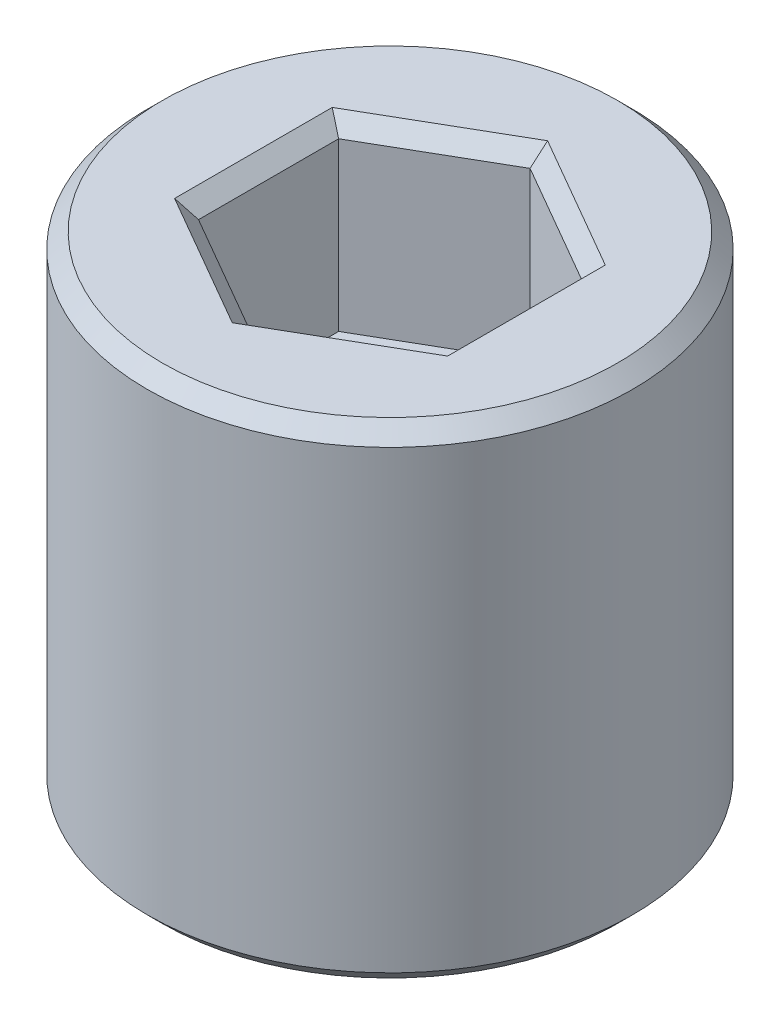
ISO-10303-21;
HEADER;
FILE_DESCRIPTION(('STEP AP214'),'2;1');
FILE_NAME('part.step','',(''),(''),'','','');
FILE_SCHEMA(('AUTOMOTIVE_DESIGN { 1 0 10303 214 1 1 1 1 }'));
ENDSEC;
DATA;
#1=APPLICATION_CONTEXT('core data for automotive mechanical design processes');
#2=APPLICATION_PROTOCOL_DEFINITION('international standard','automotive_design',2000,#1);
#3=PRODUCT_CONTEXT('',#1,'mechanical');
#4=PRODUCT('Part','Part','',(#3));
#5=PRODUCT_RELATED_PRODUCT_CATEGORY('part','',(#4));
#6=PRODUCT_DEFINITION_FORMATION('','',#4);
#7=PRODUCT_DEFINITION_CONTEXT('part definition',#1,'design');
#8=PRODUCT_DEFINITION('design','',#6,#7);
#9=PRODUCT_DEFINITION_SHAPE('','',#8);
#10=(LENGTH_UNIT() NAMED_UNIT(*) SI_UNIT(.MILLI.,.METRE.));
#11=(NAMED_UNIT(*) PLANE_ANGLE_UNIT() SI_UNIT($,.RADIAN.));
#12=(NAMED_UNIT(*) SI_UNIT($,.STERADIAN.) SOLID_ANGLE_UNIT());
#13=UNCERTAINTY_MEASURE_WITH_UNIT(LENGTH_MEASURE(1.E-05),#10,'distance_accuracy_value','');
#14=(GEOMETRIC_REPRESENTATION_CONTEXT(3) GLOBAL_UNCERTAINTY_ASSIGNED_CONTEXT((#13)) GLOBAL_UNIT_ASSIGNED_CONTEXT((#10,
#11,#12)) REPRESENTATION_CONTEXT('',''));
#15=CARTESIAN_POINT('',(0.,0.,0.));
#16=DIRECTION('',(0.,0.,1.));
#17=DIRECTION('',(1.,0.,0.));
#18=AXIS2_PLACEMENT_3D('',#15,#16,#17);
#19=CARTESIAN_POINT('',(0.,-8.,0.));
#20=DIRECTION('',(0.,1.,0.));
#21=DIRECTION('',(0.,0.,1.));
#22=AXIS2_PLACEMENT_3D('',#19,#20,#21);
#23=CYLINDRICAL_SURFACE('',#22,4.);
#24=CARTESIAN_POINT('',(0.,-0.250000000000002,0.));
#25=DIRECTION('',(0.,1.,0.));
#26=DIRECTION('',(0.,0.,1.));
#27=AXIS2_PLACEMENT_3D('',#24,#25,#26);
#28=CIRCLE('',#27,4.);
#29=CARTESIAN_POINT('',(0.,-0.250000000000002,4.));
#30=VERTEX_POINT('',#29);
#31=EDGE_CURVE('E173',#30,#30,#28,.F.);
#32=ORIENTED_EDGE('',*,*,#31,.T.);
#33=EDGE_LOOP('',(#32));
#34=FACE_BOUND('',#33,.T.);
#35=CARTESIAN_POINT('',(0.,-7.75,0.));
#36=DIRECTION('',(0.,1.,0.));
#37=DIRECTION('',(0.,0.,1.));
#38=AXIS2_PLACEMENT_3D('',#35,#36,#37);
#39=CIRCLE('',#38,4.);
#40=CARTESIAN_POINT('',(0.,-7.75,4.));
#41=VERTEX_POINT('',#40);
#42=EDGE_CURVE('E170',#41,#41,#39,.T.);
#43=ORIENTED_EDGE('',*,*,#42,.T.);
#44=EDGE_LOOP('',(#43));
#45=FACE_BOUND('',#44,.T.);
#46=ADVANCED_FACE('F51',(#34,#45),#23,.T.);
#47=CARTESIAN_POINT('',(0.,-8.,0.));
#48=DIRECTION('',(0.,1.,0.));
#49=DIRECTION('',(0.,0.,1.));
#50=AXIS2_PLACEMENT_3D('',#47,#48,#49);
#51=PLANE('',#50);
#52=CARTESIAN_POINT('',(0.,-8.,0.));
#53=DIRECTION('',(0.,1.,0.));
#54=DIRECTION('',(0.,0.,1.));
#55=AXIS2_PLACEMENT_3D('',#52,#53,#54);
#56=CIRCLE('',#55,3.75);
#57=CARTESIAN_POINT('',(0.,-8.,3.75));
#58=VERTEX_POINT('',#57);
#59=EDGE_CURVE('E176',#58,#58,#56,.F.);
#60=ORIENTED_EDGE('',*,*,#59,.T.);
#61=EDGE_LOOP('',(#60));
#62=FACE_BOUND('',#61,.T.);
#63=ADVANCED_FACE('F250',(#62),#51,.F.);
#64=CARTESIAN_POINT('',(0.,0.,0.));
#65=DIRECTION('',(0.,1.,0.));
#66=DIRECTION('',(0.,0.,1.));
#67=AXIS2_PLACEMENT_3D('',#64,#65,#66);
#68=PLANE('',#67);
#69=DIRECTION('',(-0.866025403784439,0.,0.5));
#70=VECTOR('',#69,1.);
#71=CARTESIAN_POINT('',(0.125000000000001,0.,2.52590742770461));
#72=LINE('',#71,#70);
#73=CARTESIAN_POINT('',(2.25,0.,1.29903810567666));
#74=VERTEX_POINT('',#73);
#75=CARTESIAN_POINT('',(0.,0.,2.59807621135332));
#76=VERTEX_POINT('',#75);
#77=EDGE_CURVE('E190',#74,#76,#72,.T.);
#78=ORIENTED_EDGE('',*,*,#77,.T.);
#79=DIRECTION('',(-0.866025403784439,0.,-0.5));
#80=VECTOR('',#79,1.);
#81=CARTESIAN_POINT('',(-2.125,0.,1.37120688932536));
#82=LINE('',#81,#80);
#83=CARTESIAN_POINT('',(-2.25,0.,1.29903810567666));
#84=VERTEX_POINT('',#83);
#85=EDGE_CURVE('E192',#76,#84,#82,.T.);
#86=ORIENTED_EDGE('',*,*,#85,.T.);
#87=DIRECTION('',(0.,0.,-1.));
#88=VECTOR('',#87,1.);
#89=CARTESIAN_POINT('',(-2.25,0.,-1.15470053837925));
#90=LINE('',#89,#88);
#91=CARTESIAN_POINT('',(-2.25,0.,-1.29903810567666));
#92=VERTEX_POINT('',#91);
#93=EDGE_CURVE('E182',#84,#92,#90,.T.);
#94=ORIENTED_EDGE('',*,*,#93,.T.);
#95=DIRECTION('',(0.866025403784439,0.,-0.5));
#96=VECTOR('',#95,1.);
#97=CARTESIAN_POINT('',(-0.125000000000001,0.,-2.52590742770461));
#98=LINE('',#97,#96);
#99=CARTESIAN_POINT('',(0.,0.,-2.59807621135332));
#100=VERTEX_POINT('',#99);
#101=EDGE_CURVE('E184',#92,#100,#98,.T.);
#102=ORIENTED_EDGE('',*,*,#101,.T.);
#103=DIRECTION('',(0.866025403784439,0.,0.5));
#104=VECTOR('',#103,1.);
#105=CARTESIAN_POINT('',(2.125,0.,-1.37120688932536));
#106=LINE('',#105,#104);
#107=CARTESIAN_POINT('',(2.25,0.,-1.29903810567666));
#108=VERTEX_POINT('',#107);
#109=EDGE_CURVE('E186',#100,#108,#106,.T.);
#110=ORIENTED_EDGE('',*,*,#109,.T.);
#111=DIRECTION('',(0.,0.,1.));
#112=VECTOR('',#111,1.);
#113=CARTESIAN_POINT('',(2.25,0.,1.15470053837925));
#114=LINE('',#113,#112);
#115=EDGE_CURVE('E188',#108,#74,#114,.T.);
#116=ORIENTED_EDGE('',*,*,#115,.T.);
#117=EDGE_LOOP('',(#78,#86,#94,#102,#110,#116));
#118=FACE_BOUND('',#117,.T.);
#119=CARTESIAN_POINT('',(0.,0.,0.));
#120=DIRECTION('',(0.,1.,0.));
#121=DIRECTION('',(0.,0.,1.));
#122=AXIS2_PLACEMENT_3D('',#119,#120,#121);
#123=CIRCLE('',#122,3.75);
#124=CARTESIAN_POINT('',(0.,0.,3.75));
#125=VERTEX_POINT('',#124);
#126=EDGE_CURVE('E158',#125,#125,#123,.T.);
#127=ORIENTED_EDGE('',*,*,#126,.T.);
#128=EDGE_LOOP('',(#127));
#129=FACE_BOUND('',#128,.T.);
#130=ADVANCED_FACE('F256',(#118,#129),#68,.T.);
#131=CARTESIAN_POINT('',(0.,0.,0.));
#132=DIRECTION('',(0.,-1.,0.));
#133=DIRECTION('',(0.,0.,-1.));
#134=AXIS2_PLACEMENT_3D('',#131,#132,#133);
#135=CONICAL_SURFACE('',#134,3.75,0.785398163397445);
#136=ORIENTED_EDGE('',*,*,#31,.F.);
#137=EDGE_LOOP('',(#136));
#138=FACE_BOUND('',#137,.T.);
#139=ORIENTED_EDGE('',*,*,#126,.F.);
#140=EDGE_LOOP('',(#139));
#141=FACE_BOUND('',#140,.T.);
#142=ADVANCED_FACE('F263',(#138,#141),#135,.T.);
#143=CARTESIAN_POINT('',(0.,-7.75,0.));
#144=DIRECTION('',(0.,1.,0.));
#145=DIRECTION('',(0.,0.,1.));
#146=AXIS2_PLACEMENT_3D('',#143,#144,#145);
#147=CONICAL_SURFACE('',#146,4.,0.78539816339745);
#148=ORIENTED_EDGE('',*,*,#59,.F.);
#149=EDGE_LOOP('',(#148));
#150=FACE_BOUND('',#149,.T.);
#151=ORIENTED_EDGE('',*,*,#42,.F.);
#152=EDGE_LOOP('',(#151));
#153=FACE_BOUND('',#152,.T.);
#154=ADVANCED_FACE('F246',(#150,#153),#147,.T.);
#155=CARTESIAN_POINT('',(-2.,-3.,-1.15470053837925));
#156=DIRECTION('',(-0.5,0.,-0.866025403784439));
#157=DIRECTION('',(-0.866025403784439,0.,0.5));
#158=AXIS2_PLACEMENT_3D('',#155,#156,#157);
#159=PLANE('',#158);
#160=DIRECTION('',(0.,1.,0.));
#161=VECTOR('',#160,1.);
#162=CARTESIAN_POINT('',(0.,-3.,-2.3094010767585));
#163=LINE('',#162,#161);
#164=CARTESIAN_POINT('',(0.,-3.,-2.3094010767585));
#165=VERTEX_POINT('',#164);
#166=CARTESIAN_POINT('',(0.,-0.250000000000002,-2.3094010767585));
#167=VERTEX_POINT('',#166);
#168=EDGE_CURVE('E156',#165,#167,#163,.T.);
#169=ORIENTED_EDGE('',*,*,#168,.T.);
#170=DIRECTION('',(-0.866025403784439,0.,0.5));
#171=VECTOR('',#170,1.);
#172=CARTESIAN_POINT('',(-2.,-0.250000000000002,-1.15470053837925));
#173=LINE('',#172,#171);
#174=CARTESIAN_POINT('',(-2.,-0.250000000000002,-1.15470053837925));
#175=VERTEX_POINT('',#174);
#176=EDGE_CURVE('E61',#167,#175,#173,.T.);
#177=ORIENTED_EDGE('',*,*,#176,.T.);
#178=DIRECTION('',(0.,1.,0.));
#179=VECTOR('',#178,1.);
#180=CARTESIAN_POINT('',(-2.,-3.,-1.15470053837925));
#181=LINE('',#180,#179);
#182=CARTESIAN_POINT('',(-2.,-3.,-1.15470053837925));
#183=VERTEX_POINT('',#182);
#184=EDGE_CURVE('E122',#183,#175,#181,.T.);
#185=ORIENTED_EDGE('',*,*,#184,.F.);
#186=DIRECTION('',(-0.866025403784439,0.,0.5));
#187=VECTOR('',#186,1.);
#188=CARTESIAN_POINT('',(-2.,-3.,-1.15470053837925));
#189=LINE('',#188,#187);
#190=EDGE_CURVE('E126',#165,#183,#189,.T.);
#191=ORIENTED_EDGE('',*,*,#190,.F.);
#192=EDGE_LOOP('',(#169,#177,#185,#191));
#193=FACE_BOUND('',#192,.T.);
#194=ADVANCED_FACE('F124',(#193),#159,.F.);
#195=CARTESIAN_POINT('',(0.,-3.,-2.3094010767585));
#196=DIRECTION('',(0.5,0.,-0.866025403784439));
#197=DIRECTION('',(-0.866025403784439,0.,-0.5));
#198=AXIS2_PLACEMENT_3D('',#195,#196,#197);
#199=PLANE('',#198);
#200=DIRECTION('',(0.,1.,0.));
#201=VECTOR('',#200,1.);
#202=CARTESIAN_POINT('',(2.,-3.,-1.15470053837925));
#203=LINE('',#202,#201);
#204=CARTESIAN_POINT('',(2.,-3.,-1.15470053837925));
#205=VERTEX_POINT('',#204);
#206=CARTESIAN_POINT('',(2.,-0.250000000000002,-1.15470053837925));
#207=VERTEX_POINT('',#206);
#208=EDGE_CURVE('E159',#205,#207,#203,.T.);
#209=ORIENTED_EDGE('',*,*,#208,.T.);
#210=DIRECTION('',(-0.866025403784439,0.,-0.5));
#211=VECTOR('',#210,1.);
#212=CARTESIAN_POINT('',(0.,-0.250000000000002,-2.3094010767585));
#213=LINE('',#212,#211);
#214=EDGE_CURVE('E76',#207,#167,#213,.T.);
#215=ORIENTED_EDGE('',*,*,#214,.T.);
#216=ORIENTED_EDGE('',*,*,#168,.F.);
#217=DIRECTION('',(-0.866025403784439,0.,-0.5));
#218=VECTOR('',#217,1.);
#219=CARTESIAN_POINT('',(0.,-3.,-2.3094010767585));
#220=LINE('',#219,#218);
#221=EDGE_CURVE('E131',#205,#165,#220,.T.);
#222=ORIENTED_EDGE('',*,*,#221,.F.);
#223=EDGE_LOOP('',(#209,#215,#216,#222));
#224=FACE_BOUND('',#223,.T.);
#225=ADVANCED_FACE('F238',(#224),#199,.F.);
#226=CARTESIAN_POINT('',(2.,-3.,-1.15470053837925));
#227=DIRECTION('',(1.,0.,0.));
#228=DIRECTION('',(0.,0.,-1.));
#229=AXIS2_PLACEMENT_3D('',#226,#227,#228);
#230=PLANE('',#229);
#231=DIRECTION('',(0.,1.,0.));
#232=VECTOR('',#231,1.);
#233=CARTESIAN_POINT('',(2.,-3.,1.15470053837925));
#234=LINE('',#233,#232);
#235=CARTESIAN_POINT('',(2.,-3.,1.15470053837925));
#236=VERTEX_POINT('',#235);
#237=CARTESIAN_POINT('',(2.,-0.250000000000002,1.15470053837925));
#238=VERTEX_POINT('',#237);
#239=EDGE_CURVE('E161',#236,#238,#234,.T.);
#240=ORIENTED_EDGE('',*,*,#239,.T.);
#241=DIRECTION('',(0.,0.,-1.));
#242=VECTOR('',#241,1.);
#243=CARTESIAN_POINT('',(2.,-0.250000000000002,-1.15470053837925));
#244=LINE('',#243,#242);
#245=EDGE_CURVE('E197',#238,#207,#244,.T.);
#246=ORIENTED_EDGE('',*,*,#245,.T.);
#247=ORIENTED_EDGE('',*,*,#208,.F.);
#248=DIRECTION('',(0.,0.,-1.));
#249=VECTOR('',#248,1.);
#250=CARTESIAN_POINT('',(2.,-3.,-1.15470053837925));
#251=LINE('',#250,#249);
#252=EDGE_CURVE('E153',#236,#205,#251,.T.);
#253=ORIENTED_EDGE('',*,*,#252,.F.);
#254=EDGE_LOOP('',(#240,#246,#247,#253));
#255=FACE_BOUND('',#254,.T.);
#256=ADVANCED_FACE('F237',(#255),#230,.F.);
#257=CARTESIAN_POINT('',(2.,-3.,1.15470053837925));
#258=DIRECTION('',(0.5,0.,0.866025403784439));
#259=DIRECTION('',(0.866025403784439,0.,-0.5));
#260=AXIS2_PLACEMENT_3D('',#257,#258,#259);
#261=PLANE('',#260);
#262=DIRECTION('',(0.,1.,0.));
#263=VECTOR('',#262,1.);
#264=CARTESIAN_POINT('',(0.,-3.,2.3094010767585));
#265=LINE('',#264,#263);
#266=CARTESIAN_POINT('',(0.,-3.,2.3094010767585));
#267=VERTEX_POINT('',#266);
#268=CARTESIAN_POINT('',(0.,-0.250000000000002,2.3094010767585));
#269=VERTEX_POINT('',#268);
#270=EDGE_CURVE('E164',#267,#269,#265,.T.);
#271=ORIENTED_EDGE('',*,*,#270,.T.);
#272=DIRECTION('',(0.866025403784439,0.,-0.5));
#273=VECTOR('',#272,1.);
#274=CARTESIAN_POINT('',(2.,-0.250000000000002,1.15470053837925));
#275=LINE('',#274,#273);
#276=EDGE_CURVE('E195',#269,#238,#275,.T.);
#277=ORIENTED_EDGE('',*,*,#276,.T.);
#278=ORIENTED_EDGE('',*,*,#239,.F.);
#279=DIRECTION('',(0.866025403784439,0.,-0.5));
#280=VECTOR('',#279,1.);
#281=CARTESIAN_POINT('',(2.,-3.,1.15470053837925));
#282=LINE('',#281,#280);
#283=EDGE_CURVE('E150',#267,#236,#282,.T.);
#284=ORIENTED_EDGE('',*,*,#283,.F.);
#285=EDGE_LOOP('',(#271,#277,#278,#284));
#286=FACE_BOUND('',#285,.T.);
#287=ADVANCED_FACE('F234',(#286),#261,.F.);
#288=CARTESIAN_POINT('',(0.,-3.,2.3094010767585));
#289=DIRECTION('',(-0.5,0.,0.866025403784439));
#290=DIRECTION('',(0.866025403784439,0.,0.5));
#291=AXIS2_PLACEMENT_3D('',#288,#289,#290);
#292=PLANE('',#291);
#293=DIRECTION('',(0.,1.,0.));
#294=VECTOR('',#293,1.);
#295=CARTESIAN_POINT('',(-2.,-3.,1.15470053837925));
#296=LINE('',#295,#294);
#297=CARTESIAN_POINT('',(-2.,-3.,1.15470053837925));
#298=VERTEX_POINT('',#297);
#299=CARTESIAN_POINT('',(-2.,-0.250000000000002,1.15470053837925));
#300=VERTEX_POINT('',#299);
#301=EDGE_CURVE('E130',#298,#300,#296,.T.);
#302=ORIENTED_EDGE('',*,*,#301,.T.);
#303=DIRECTION('',(0.866025403784439,0.,0.5));
#304=VECTOR('',#303,1.);
#305=CARTESIAN_POINT('',(0.,-0.250000000000002,2.3094010767585));
#306=LINE('',#305,#304);
#307=EDGE_CURVE('E179',#300,#269,#306,.T.);
#308=ORIENTED_EDGE('',*,*,#307,.T.);
#309=ORIENTED_EDGE('',*,*,#270,.F.);
#310=DIRECTION('',(0.866025403784439,0.,0.5));
#311=VECTOR('',#310,1.);
#312=CARTESIAN_POINT('',(0.,-3.,2.3094010767585));
#313=LINE('',#312,#311);
#314=EDGE_CURVE('E140',#298,#267,#313,.T.);
#315=ORIENTED_EDGE('',*,*,#314,.F.);
#316=EDGE_LOOP('',(#302,#308,#309,#315));
#317=FACE_BOUND('',#316,.T.);
#318=ADVANCED_FACE('F230',(#317),#292,.F.);
#319=CARTESIAN_POINT('',(-2.,-3.,1.15470053837925));
#320=DIRECTION('',(-1.,0.,0.));
#321=DIRECTION('',(0.,0.,1.));
#322=AXIS2_PLACEMENT_3D('',#319,#320,#321);
#323=PLANE('',#322);
#324=ORIENTED_EDGE('',*,*,#184,.T.);
#325=DIRECTION('',(0.,0.,1.));
#326=VECTOR('',#325,1.);
#327=CARTESIAN_POINT('',(-2.,-0.250000000000002,1.15470053837925));
#328=LINE('',#327,#326);
#329=EDGE_CURVE('E11',#175,#300,#328,.T.);
#330=ORIENTED_EDGE('',*,*,#329,.T.);
#331=ORIENTED_EDGE('',*,*,#301,.F.);
#332=DIRECTION('',(0.,0.,1.));
#333=VECTOR('',#332,1.);
#334=CARTESIAN_POINT('',(-2.,-3.,1.15470053837925));
#335=LINE('',#334,#333);
#336=EDGE_CURVE('E134',#183,#298,#335,.T.);
#337=ORIENTED_EDGE('',*,*,#336,.F.);
#338=EDGE_LOOP('',(#324,#330,#331,#337));
#339=FACE_BOUND('',#338,.T.);
#340=ADVANCED_FACE('F135',(#339),#323,.F.);
#341=CARTESIAN_POINT('',(0.,-3.,0.));
#342=DIRECTION('',(0.,-1.,0.));
#343=DIRECTION('',(0.,0.,-1.));
#344=AXIS2_PLACEMENT_3D('',#341,#342,#343);
#345=PLANE('',#344);
#346=ORIENTED_EDGE('',*,*,#190,.T.);
#347=ORIENTED_EDGE('',*,*,#336,.T.);
#348=ORIENTED_EDGE('',*,*,#314,.T.);
#349=ORIENTED_EDGE('',*,*,#283,.T.);
#350=ORIENTED_EDGE('',*,*,#252,.T.);
#351=ORIENTED_EDGE('',*,*,#221,.T.);
#352=EDGE_LOOP('',(#346,#347,#348,#349,#350,#351));
#353=FACE_BOUND('',#352,.T.);
#354=ADVANCED_FACE('F142',(#353),#345,.F.);
#355=CARTESIAN_POINT('',(0.,-0.250000000000002,-2.3094010767585));
#356=DIRECTION('',(-0.353553390593274,0.707106781186547,0.612372435695795));
#357=DIRECTION('',(0.866025403784439,0.,0.5));
#358=AXIS2_PLACEMENT_3D('',#355,#356,#357);
#359=PLANE('',#358);
#360=DIRECTION('',(0.654653670707977,0.654653670707977,-0.377964473009227));
#361=VECTOR('',#360,1.);
#362=CARTESIAN_POINT('',(2.,-0.250000000000002,-1.15470053837925));
#363=LINE('',#362,#361);
#364=EDGE_CURVE('E147',#108,#207,#363,.F.);
#365=ORIENTED_EDGE('',*,*,#364,.F.);
#366=ORIENTED_EDGE('',*,*,#109,.F.);
#367=DIRECTION('',(0.,0.654653670707977,-0.755928946018454));
#368=VECTOR('',#367,1.);
#369=CARTESIAN_POINT('',(0.,-0.250000000000002,-2.3094010767585));
#370=LINE('',#369,#368);
#371=EDGE_CURVE('E56',#167,#100,#370,.T.);
#372=ORIENTED_EDGE('',*,*,#371,.F.);
#373=ORIENTED_EDGE('',*,*,#214,.F.);
#374=EDGE_LOOP('',(#365,#366,#372,#373));
#375=FACE_BOUND('',#374,.T.);
#376=ADVANCED_FACE('F54',(#375),#359,.T.);
#377=CARTESIAN_POINT('',(-2.,-0.250000000000002,-1.15470053837925));
#378=DIRECTION('',(0.353553390593274,0.707106781186547,0.612372435695795));
#379=DIRECTION('',(0.866025403784439,0.,-0.5));
#380=AXIS2_PLACEMENT_3D('',#377,#378,#379);
#381=PLANE('',#380);
#382=ORIENTED_EDGE('',*,*,#371,.T.);
#383=ORIENTED_EDGE('',*,*,#101,.F.);
#384=DIRECTION('',(-0.654653670707977,0.654653670707977,-0.377964473009227));
#385=VECTOR('',#384,1.);
#386=CARTESIAN_POINT('',(-2.,-0.250000000000002,-1.15470053837925));
#387=LINE('',#386,#385);
#388=EDGE_CURVE('E208',#175,#92,#387,.T.);
#389=ORIENTED_EDGE('',*,*,#388,.F.);
#390=ORIENTED_EDGE('',*,*,#176,.F.);
#391=EDGE_LOOP('',(#382,#383,#389,#390));
#392=FACE_BOUND('',#391,.T.);
#393=ADVANCED_FACE('F222',(#392),#381,.T.);
#394=CARTESIAN_POINT('',(2.,-0.250000000000002,-1.15470053837925));
#395=DIRECTION('',(-0.707106781186547,0.707106781186547,0.));
#396=DIRECTION('',(0.,0.,1.));
#397=AXIS2_PLACEMENT_3D('',#394,#395,#396);
#398=PLANE('',#397);
#399=ORIENTED_EDGE('',*,*,#364,.T.);
#400=ORIENTED_EDGE('',*,*,#245,.F.);
#401=DIRECTION('',(0.654653670707977,0.654653670707977,0.377964473009227));
#402=VECTOR('',#401,1.);
#403=CARTESIAN_POINT('',(2.,-0.250000000000002,1.15470053837925));
#404=LINE('',#403,#402);
#405=EDGE_CURVE('E205',#74,#238,#404,.F.);
#406=ORIENTED_EDGE('',*,*,#405,.F.);
#407=ORIENTED_EDGE('',*,*,#115,.F.);
#408=EDGE_LOOP('',(#399,#400,#406,#407));
#409=FACE_BOUND('',#408,.T.);
#410=ADVANCED_FACE('F215',(#409),#398,.T.);
#411=CARTESIAN_POINT('',(-2.,-0.250000000000002,1.15470053837925));
#412=DIRECTION('',(0.707106781186547,0.707106781186547,0.));
#413=DIRECTION('',(0.,0.,-1.));
#414=AXIS2_PLACEMENT_3D('',#411,#412,#413);
#415=PLANE('',#414);
#416=ORIENTED_EDGE('',*,*,#388,.T.);
#417=ORIENTED_EDGE('',*,*,#93,.F.);
#418=DIRECTION('',(0.654653670707977,-0.654653670707977,-0.377964473009227));
#419=VECTOR('',#418,1.);
#420=CARTESIAN_POINT('',(-1.42857142857143,-0.821428571428574,0.824786098842322));
#421=LINE('',#420,#419);
#422=EDGE_CURVE('E203',#300,#84,#421,.F.);
#423=ORIENTED_EDGE('',*,*,#422,.F.);
#424=ORIENTED_EDGE('',*,*,#329,.F.);
#425=EDGE_LOOP('',(#416,#417,#423,#424));
#426=FACE_BOUND('',#425,.T.);
#427=ADVANCED_FACE('F227',(#426),#415,.T.);
#428=CARTESIAN_POINT('',(2.,-0.250000000000002,1.15470053837925));
#429=DIRECTION('',(-0.353553390593274,0.707106781186547,-0.612372435695795));
#430=DIRECTION('',(-0.866025403784439,0.,0.5));
#431=AXIS2_PLACEMENT_3D('',#428,#429,#430);
#432=PLANE('',#431);
#433=ORIENTED_EDGE('',*,*,#405,.T.);
#434=ORIENTED_EDGE('',*,*,#276,.F.);
#435=DIRECTION('',(0.,0.654653670707977,0.755928946018454));
#436=VECTOR('',#435,1.);
#437=CARTESIAN_POINT('',(0.,-0.250000000000002,2.3094010767585));
#438=LINE('',#437,#436);
#439=EDGE_CURVE('E201',#76,#269,#438,.F.);
#440=ORIENTED_EDGE('',*,*,#439,.F.);
#441=ORIENTED_EDGE('',*,*,#77,.F.);
#442=EDGE_LOOP('',(#433,#434,#440,#441));
#443=FACE_BOUND('',#442,.T.);
#444=ADVANCED_FACE('F282',(#443),#432,.T.);
#445=CARTESIAN_POINT('',(0.,-0.250000000000002,2.3094010767585));
#446=DIRECTION('',(0.353553390593274,0.707106781186547,-0.612372435695795));
#447=DIRECTION('',(-0.866025403784439,0.,-0.5));
#448=AXIS2_PLACEMENT_3D('',#445,#446,#447);
#449=PLANE('',#448);
#450=ORIENTED_EDGE('',*,*,#422,.T.);
#451=ORIENTED_EDGE('',*,*,#85,.F.);
#452=ORIENTED_EDGE('',*,*,#439,.T.);
#453=ORIENTED_EDGE('',*,*,#307,.F.);
#454=EDGE_LOOP('',(#450,#451,#452,#453));
#455=FACE_BOUND('',#454,.T.);
#456=ADVANCED_FACE('F276',(#455),#449,.T.);
#457=CLOSED_SHELL('',(#46,#63,#130,#142,#154,#194,#225,#256,#287,#318,#340,#354,#376,#393,#410,
#427,#444,#456));
#458=MANIFOLD_SOLID_BREP('B2',#457);
#459=ADVANCED_BREP_SHAPE_REPRESENTATION('',(#18,#458),#14);
#460=SHAPE_DEFINITION_REPRESENTATION(#9,#459);
ENDSEC;
END-ISO-10303-21;
